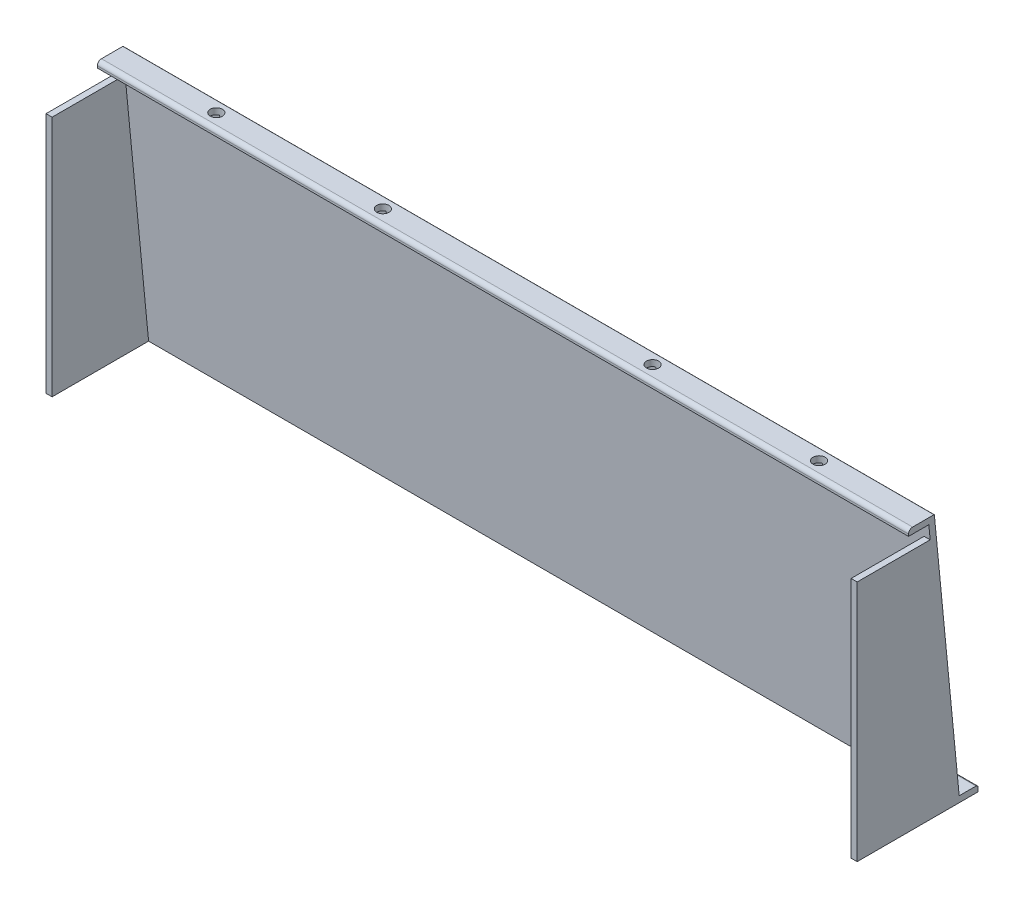
ISO-10303-21;
HEADER;
FILE_DESCRIPTION(('STEP AP214'),'2;1');
FILE_NAME('part.step','',(''),(''),'','','');
FILE_SCHEMA(('AUTOMOTIVE_DESIGN { 1 0 10303 214 1 1 1 1 }'));
ENDSEC;
DATA;
#1=APPLICATION_CONTEXT('core data for automotive mechanical design processes');
#2=APPLICATION_PROTOCOL_DEFINITION('international standard','automotive_design',2000,#1);
#3=PRODUCT_CONTEXT('',#1,'mechanical');
#4=PRODUCT('Part','Part','',(#3));
#5=PRODUCT_RELATED_PRODUCT_CATEGORY('part','',(#4));
#6=PRODUCT_DEFINITION_FORMATION('','',#4);
#7=PRODUCT_DEFINITION_CONTEXT('part definition',#1,'design');
#8=PRODUCT_DEFINITION('design','',#6,#7);
#9=PRODUCT_DEFINITION_SHAPE('','',#8);
#10=(LENGTH_UNIT() NAMED_UNIT(*) SI_UNIT(.MILLI.,.METRE.));
#11=(NAMED_UNIT(*) PLANE_ANGLE_UNIT() SI_UNIT($,.RADIAN.));
#12=(NAMED_UNIT(*) SI_UNIT($,.STERADIAN.) SOLID_ANGLE_UNIT());
#13=UNCERTAINTY_MEASURE_WITH_UNIT(LENGTH_MEASURE(1.E-05),#10,'distance_accuracy_value','');
#14=(GEOMETRIC_REPRESENTATION_CONTEXT(3) GLOBAL_UNCERTAINTY_ASSIGNED_CONTEXT((#13)) GLOBAL_UNIT_ASSIGNED_CONTEXT((#10,
#11,#12)) REPRESENTATION_CONTEXT('',''));
#15=CARTESIAN_POINT('',(0.,0.,0.));
#16=DIRECTION('',(0.,0.,1.));
#17=DIRECTION('',(1.,0.,0.));
#18=AXIS2_PLACEMENT_3D('',#15,#16,#17);
#19=CARTESIAN_POINT('',(165.,-54.139738820251,-5.69));
#20=DIRECTION('',(0.,0.0965954629432991,-0.995323724493077));
#21=DIRECTION('',(0.,0.995323724493077,0.0965954629432991));
#22=AXIS2_PLACEMENT_3D('',#19,#20,#21);
#23=PLANE('',#22);
#24=DIRECTION('',(-1.,0.,0.));
#25=VECTOR('',#24,1.);
#26=CARTESIAN_POINT('',(-16.,1.09388318904339,-0.329616079943947));
#27=LINE('',#26,#25);
#28=CARTESIAN_POINT('',(-16.,1.09388318904339,-0.329616079943947));
#29=VERTEX_POINT('',#28);
#30=CARTESIAN_POINT('',(-17.5,1.09388318904339,-0.329616079943947));
#31=VERTEX_POINT('',#30);
#32=EDGE_CURVE('E53',#29,#31,#27,.T.);
#33=ORIENTED_EDGE('',*,*,#32,.F.);
#34=DIRECTION('',(0.,0.995323724493077,0.096595462943299));
#35=VECTOR('',#34,1.);
#36=CARTESIAN_POINT('',(-16.,-58.6297388202511,-6.12575132184889));
#37=LINE('',#36,#35);
#38=CARTESIAN_POINT('',(-16.,-58.6297388202511,-6.12575132184889));
#39=VERTEX_POINT('',#38);
#40=EDGE_CURVE('E185',#39,#29,#37,.T.);
#41=ORIENTED_EDGE('',*,*,#40,.F.);
#42=DIRECTION('',(-1.,0.,0.));
#43=VECTOR('',#42,1.);
#44=CARTESIAN_POINT('',(165.,-58.6297388202511,-6.12575132184889));
#45=LINE('',#44,#43);
#46=CARTESIAN_POINT('',(181.,-58.6297388202511,-6.12575132184889));
#47=VERTEX_POINT('',#46);
#48=EDGE_CURVE('E193',#47,#39,#45,.T.);
#49=ORIENTED_EDGE('',*,*,#48,.F.);
#50=DIRECTION('',(0.,0.995323724493077,0.096595462943299));
#51=VECTOR('',#50,1.);
#52=CARTESIAN_POINT('',(181.,-58.6297388202511,-6.12575132184889));
#53=LINE('',#52,#51);
#54=CARTESIAN_POINT('',(181.,1.0938831890434,-0.329616079943946));
#55=VERTEX_POINT('',#54);
#56=EDGE_CURVE('E61',#47,#55,#53,.T.);
#57=ORIENTED_EDGE('',*,*,#56,.T.);
#58=DIRECTION('',(1.,0.,0.));
#59=VECTOR('',#58,1.);
#60=CARTESIAN_POINT('',(181.,1.09388318904339,-0.329616079943947));
#61=LINE('',#60,#59);
#62=CARTESIAN_POINT('',(182.5,1.09388318904339,-0.329616079943947));
#63=VERTEX_POINT('',#62);
#64=EDGE_CURVE('E461',#55,#63,#61,.T.);
#65=ORIENTED_EDGE('',*,*,#64,.T.);
#66=DIRECTION('',(0.,0.995323724493077,0.0965954629432991));
#67=VECTOR('',#66,1.);
#68=CARTESIAN_POINT('',(182.5,0.0418972057264861,-0.431710574998923));
#69=LINE('',#68,#67);
#70=CARTESIAN_POINT('',(182.5,4.49026117974896,0.));
#71=VERTEX_POINT('',#70);
#72=EDGE_CURVE('E440',#63,#71,#69,.T.);
#73=ORIENTED_EDGE('',*,*,#72,.T.);
#74=DIRECTION('',(-1.,0.,0.));
#75=VECTOR('',#74,1.);
#76=CARTESIAN_POINT('',(165.,4.49026117974896,0.));
#77=LINE('',#76,#75);
#78=CARTESIAN_POINT('',(157.430674827087,4.49026117974896,0.));
#79=VERTEX_POINT('',#78);
#80=EDGE_CURVE('E208',#71,#79,#77,.T.);
#81=ORIENTED_EDGE('',*,*,#80,.T.);
#82=CARTESIAN_POINT('',(156.807985478473,18.5516283667744,1.36464573246079));
#83=DIRECTION('',(0.,0.0965954629432991,-0.995323724493077));
#84=DIRECTION('',(0.,0.995323724493077,0.0965954629432991));
#85=AXIS2_PLACEMENT_3D('',#82,#83,#84);
#86=ELLIPSE('',#85,15.5286796532099,1.5);
#87=CARTESIAN_POINT('',(156.18529612986,4.49026117974896,0.));
#88=VERTEX_POINT('',#87);
#89=EDGE_CURVE('E11',#79,#88,#86,.T.);
#90=ORIENTED_EDGE('',*,*,#89,.T.);
#91=CARTESIAN_POINT('',(116.372664199688,4.49026117974896,0.));
#92=VERTEX_POINT('',#91);
#93=EDGE_CURVE('E215',#88,#92,#77,.T.);
#94=ORIENTED_EDGE('',*,*,#93,.T.);
#95=CARTESIAN_POINT('',(115.749974851074,18.5516283667743,1.36464573246079));
#96=DIRECTION('',(0.,0.0965954629432991,-0.995323724493077));
#97=DIRECTION('',(0.,0.995323724493077,0.0965954629432991));
#98=AXIS2_PLACEMENT_3D('',#95,#96,#97);
#99=ELLIPSE('',#98,15.5286796532099,1.5);
#100=CARTESIAN_POINT('',(115.127285502461,4.49026117974896,0.));
#101=VERTEX_POINT('',#100);
#102=EDGE_CURVE('E46',#92,#101,#99,.T.);
#103=ORIENTED_EDGE('',*,*,#102,.T.);
#104=CARTESIAN_POINT('',(49.8727144975393,4.49026117974896,0.));
#105=VERTEX_POINT('',#104);
#106=EDGE_CURVE('E207',#101,#105,#77,.T.);
#107=ORIENTED_EDGE('',*,*,#106,.T.);
#108=CARTESIAN_POINT('',(49.2500251489258,18.5516283667744,1.36464573246079));
#109=DIRECTION('',(0.,0.0965954629432991,-0.995323724493077));
#110=DIRECTION('',(0.,0.995323724493077,0.0965954629432991));
#111=AXIS2_PLACEMENT_3D('',#108,#109,#110);
#112=ELLIPSE('',#111,15.5286796532099,1.5);
#113=CARTESIAN_POINT('',(48.6273358003125,4.49026117974896,0.));
#114=VERTEX_POINT('',#113);
#115=EDGE_CURVE('E223',#105,#114,#112,.T.);
#116=ORIENTED_EDGE('',*,*,#115,.T.);
#117=CARTESIAN_POINT('',(8.81470387013994,4.49026117974896,0.));
#118=VERTEX_POINT('',#117);
#119=EDGE_CURVE('E205',#114,#118,#77,.T.);
#120=ORIENTED_EDGE('',*,*,#119,.T.);
#121=CARTESIAN_POINT('',(8.19201452152654,18.5516283667746,1.36464573246081));
#122=DIRECTION('',(0.,0.0965954629432991,-0.995323724493077));
#123=DIRECTION('',(0.,0.995323724493077,0.0965954629432991));
#124=AXIS2_PLACEMENT_3D('',#121,#122,#123);
#125=ELLIPSE('',#124,15.5286796532099,1.5);
#126=CARTESIAN_POINT('',(7.5693251729132,4.49026117974896,0.));
#127=VERTEX_POINT('',#126);
#128=EDGE_CURVE('E226',#118,#127,#125,.T.);
#129=ORIENTED_EDGE('',*,*,#128,.T.);
#130=CARTESIAN_POINT('',(-17.5,4.49026117974896,0.));
#131=VERTEX_POINT('',#130);
#132=EDGE_CURVE('E201',#127,#131,#77,.T.);
#133=ORIENTED_EDGE('',*,*,#132,.T.);
#134=DIRECTION('',(0.,0.995323724493077,0.0965954629432991));
#135=VECTOR('',#134,1.);
#136=CARTESIAN_POINT('',(-17.5,0.0418972057264861,-0.431710574998923));
#137=LINE('',#136,#135);
#138=EDGE_CURVE('E308',#31,#131,#137,.T.);
#139=ORIENTED_EDGE('',*,*,#138,.F.);
#140=EDGE_LOOP('',(#33,#41,#49,#57,#65,#73,#81,#90,#94,#103,#107,#116,#120,#129,#133,#139));
#141=FACE_BOUND('',#140,.T.);
#142=ADVANCED_FACE('F38',(#141),#23,.F.);
#143=CARTESIAN_POINT('',(165.,5.89026117974896,-1.27070853507839));
#144=DIRECTION('',(-1.,0.,0.));
#145=DIRECTION('',(0.,0.,1.));
#146=AXIS2_PLACEMENT_3D('',#143,#144,#145);
#147=CYLINDRICAL_SURFACE('',#146,0.099999999999998);
#148=DIRECTION('',(-1.,0.,0.));
#149=VECTOR('',#148,1.);
#150=CARTESIAN_POINT('',(165.,5.89992072604329,-1.3702409075277));
#151=LINE('',#150,#149);
#152=CARTESIAN_POINT('',(182.5,5.89992072604329,-1.3702409075277));
#153=VERTEX_POINT('',#152);
#154=CARTESIAN_POINT('',(-17.5,5.89992072604329,-1.3702409075277));
#155=VERTEX_POINT('',#154);
#156=EDGE_CURVE('E277',#153,#155,#151,.T.);
#157=ORIENTED_EDGE('',*,*,#156,.T.);
#158=CARTESIAN_POINT('',(-17.5,5.89026117974896,-1.27070853507839));
#159=DIRECTION('',(-1.,0.,0.));
#160=DIRECTION('',(0.,0.,1.));
#161=AXIS2_PLACEMENT_3D('',#158,#159,#160);
#162=CIRCLE('',#161,0.099999999999998);
#163=CARTESIAN_POINT('',(-17.5,5.99026117974896,-1.27070853507839));
#164=VERTEX_POINT('',#163);
#165=EDGE_CURVE('E396',#164,#155,#162,.T.);
#166=ORIENTED_EDGE('',*,*,#165,.F.);
#167=DIRECTION('',(-1.,0.,0.));
#168=VECTOR('',#167,1.);
#169=CARTESIAN_POINT('',(165.,5.99026117974896,-1.27070853507839));
#170=LINE('',#169,#168);
#171=CARTESIAN_POINT('',(182.5,5.99026117974896,-1.27070853507839));
#172=VERTEX_POINT('',#171);
#173=EDGE_CURVE('E221',#172,#164,#170,.T.);
#174=ORIENTED_EDGE('',*,*,#173,.F.);
#175=CARTESIAN_POINT('',(182.5,5.89026117974896,-1.27070853507839));
#176=DIRECTION('',(-1.,0.,0.));
#177=DIRECTION('',(0.,0.,1.));
#178=AXIS2_PLACEMENT_3D('',#175,#176,#177);
#179=CIRCLE('',#178,0.099999999999998);
#180=EDGE_CURVE('E401',#172,#153,#179,.T.);
#181=ORIENTED_EDGE('',*,*,#180,.T.);
#182=EDGE_LOOP('',(#157,#166,#174,#181));
#183=FACE_BOUND('',#182,.T.);
#184=ADVANCED_FACE('F40',(#183),#147,.T.);
#185=CARTESIAN_POINT('',(165.,5.99026117974896,4.00000000000003));
#186=DIRECTION('',(0.,-1.,0.));
#187=DIRECTION('',(0.,0.,-1.));
#188=AXIS2_PLACEMENT_3D('',#185,#186,#187);
#189=PLANE('',#188);
#190=CARTESIAN_POINT('',(156.807985478473,5.99026117974896,1.3646457324608));
#191=DIRECTION('',(0.,1.,0.));
#192=DIRECTION('',(0.,0.,1.));
#193=AXIS2_PLACEMENT_3D('',#190,#191,#192);
#194=CIRCLE('',#193,1.5);
#195=CARTESIAN_POINT('',(156.807985478473,5.99026117974896,2.86464573246079));
#196=VERTEX_POINT('',#195);
#197=EDGE_CURVE('E231',#196,#196,#194,.T.);
#198=ORIENTED_EDGE('',*,*,#197,.F.);
#199=EDGE_LOOP('',(#198));
#200=FACE_BOUND('',#199,.T.);
#201=CARTESIAN_POINT('',(115.749974851074,5.99026117974896,1.36464573246079));
#202=DIRECTION('',(0.,1.,0.));
#203=DIRECTION('',(0.,0.,1.));
#204=AXIS2_PLACEMENT_3D('',#201,#202,#203);
#205=CIRCLE('',#204,1.5);
#206=CARTESIAN_POINT('',(115.749974851074,5.99026117974896,2.86464573246078));
#207=VERTEX_POINT('',#206);
#208=EDGE_CURVE('E325',#207,#207,#205,.T.);
#209=ORIENTED_EDGE('',*,*,#208,.F.);
#210=EDGE_LOOP('',(#209));
#211=FACE_BOUND('',#210,.T.);
#212=CARTESIAN_POINT('',(8.19201452152654,5.99026117974896,1.36464573246081));
#213=DIRECTION('',(0.,1.,0.));
#214=DIRECTION('',(0.,0.,-1.));
#215=AXIS2_PLACEMENT_3D('',#212,#213,#214);
#216=CIRCLE('',#215,1.5);
#217=CARTESIAN_POINT('',(8.19201452152654,5.99026117974896,-0.135354267539184));
#218=VERTEX_POINT('',#217);
#219=EDGE_CURVE('E322',#218,#218,#216,.T.);
#220=ORIENTED_EDGE('',*,*,#219,.F.);
#221=EDGE_LOOP('',(#220));
#222=FACE_BOUND('',#221,.T.);
#223=CARTESIAN_POINT('',(49.2500251489258,5.99026117974896,1.3646457324608));
#224=DIRECTION('',(0.,1.,0.));
#225=DIRECTION('',(0.,0.,-1.));
#226=AXIS2_PLACEMENT_3D('',#223,#224,#225);
#227=CIRCLE('',#226,1.5);
#228=CARTESIAN_POINT('',(49.2500251489258,5.99026117974896,-0.135354267539202));
#229=VERTEX_POINT('',#228);
#230=EDGE_CURVE('E273',#229,#229,#227,.T.);
#231=ORIENTED_EDGE('',*,*,#230,.F.);
#232=EDGE_LOOP('',(#231));
#233=FACE_BOUND('',#232,.T.);
#234=ORIENTED_EDGE('',*,*,#173,.T.);
#235=DIRECTION('',(0.,0.,-1.));
#236=VECTOR('',#235,1.);
#237=CARTESIAN_POINT('',(-17.5,5.99026117974896,0.));
#238=LINE('',#237,#236);
#239=CARTESIAN_POINT('',(-17.5,5.99026117974896,4.00000000000003));
#240=VERTEX_POINT('',#239);
#241=EDGE_CURVE('E390',#240,#164,#238,.T.);
#242=ORIENTED_EDGE('',*,*,#241,.F.);
#243=DIRECTION('',(-1.,0.,0.));
#244=VECTOR('',#243,1.);
#245=CARTESIAN_POINT('',(165.,5.99026117974896,4.00000000000003));
#246=LINE('',#245,#244);
#247=CARTESIAN_POINT('',(182.5,5.99026117974896,4.00000000000003));
#248=VERTEX_POINT('',#247);
#249=EDGE_CURVE('E219',#248,#240,#246,.T.);
#250=ORIENTED_EDGE('',*,*,#249,.F.);
#251=DIRECTION('',(0.,0.,-1.));
#252=VECTOR('',#251,1.);
#253=CARTESIAN_POINT('',(182.5,5.99026117974896,0.));
#254=LINE('',#253,#252);
#255=EDGE_CURVE('E392',#248,#172,#254,.T.);
#256=ORIENTED_EDGE('',*,*,#255,.T.);
#257=EDGE_LOOP('',(#234,#242,#250,#256));
#258=FACE_BOUND('',#257,.T.);
#259=ADVANCED_FACE('F361',(#200,#211,#222,#233,#258),#189,.F.);
#260=CARTESIAN_POINT('',(165.,4.99026117974896,4.00000000000003));
#261=DIRECTION('',(-1.,0.,0.));
#262=DIRECTION('',(0.,0.,1.));
#263=AXIS2_PLACEMENT_3D('',#260,#261,#262);
#264=CYLINDRICAL_SURFACE('',#263,1.);
#265=ORIENTED_EDGE('',*,*,#249,.T.);
#266=CARTESIAN_POINT('',(-17.5,4.99026117974896,4.00000000000003));
#267=DIRECTION('',(-1.,0.,0.));
#268=DIRECTION('',(0.,0.,1.));
#269=AXIS2_PLACEMENT_3D('',#266,#267,#268);
#270=CIRCLE('',#269,1.);
#271=CARTESIAN_POINT('',(-17.5,4.99026117974896,5.00000000000003));
#272=VERTEX_POINT('',#271);
#273=EDGE_CURVE('E319',#272,#240,#270,.T.);
#274=ORIENTED_EDGE('',*,*,#273,.F.);
#275=DIRECTION('',(-1.,0.,0.));
#276=VECTOR('',#275,1.);
#277=CARTESIAN_POINT('',(165.,4.99026117974896,5.00000000000003));
#278=LINE('',#277,#276);
#279=CARTESIAN_POINT('',(182.5,4.99026117974896,5.00000000000003));
#280=VERTEX_POINT('',#279);
#281=EDGE_CURVE('E217',#280,#272,#278,.T.);
#282=ORIENTED_EDGE('',*,*,#281,.F.);
#283=CARTESIAN_POINT('',(182.5,4.99026117974896,4.00000000000003));
#284=DIRECTION('',(-1.,0.,0.));
#285=DIRECTION('',(0.,0.,1.));
#286=AXIS2_PLACEMENT_3D('',#283,#284,#285);
#287=CIRCLE('',#286,1.);
#288=EDGE_CURVE('E428',#280,#248,#287,.T.);
#289=ORIENTED_EDGE('',*,*,#288,.T.);
#290=EDGE_LOOP('',(#265,#274,#282,#289));
#291=FACE_BOUND('',#290,.T.);
#292=ADVANCED_FACE('F371',(#291),#264,.T.);
#293=CARTESIAN_POINT('',(165.,4.49026117974896,5.00000000000003));
#294=DIRECTION('',(0.,0.,-1.));
#295=DIRECTION('',(-1.,0.,0.));
#296=AXIS2_PLACEMENT_3D('',#293,#294,#295);
#297=PLANE('',#296);
#298=ORIENTED_EDGE('',*,*,#281,.T.);
#299=DIRECTION('',(0.,1.,0.));
#300=VECTOR('',#299,1.);
#301=CARTESIAN_POINT('',(-17.5,0.,5.00000000000003));
#302=LINE('',#301,#300);
#303=CARTESIAN_POINT('',(-17.5,4.49026117974896,5.00000000000003));
#304=VERTEX_POINT('',#303);
#305=EDGE_CURVE('E316',#304,#272,#302,.T.);
#306=ORIENTED_EDGE('',*,*,#305,.F.);
#307=DIRECTION('',(-1.,0.,0.));
#308=VECTOR('',#307,1.);
#309=CARTESIAN_POINT('',(165.,4.49026117974896,5.00000000000003));
#310=LINE('',#309,#308);
#311=CARTESIAN_POINT('',(182.5,4.49026117974896,5.00000000000003));
#312=VERTEX_POINT('',#311);
#313=EDGE_CURVE('E214',#312,#304,#310,.T.);
#314=ORIENTED_EDGE('',*,*,#313,.F.);
#315=DIRECTION('',(0.,1.,0.));
#316=VECTOR('',#315,1.);
#317=CARTESIAN_POINT('',(182.5,0.,5.00000000000003));
#318=LINE('',#317,#316);
#319=EDGE_CURVE('E432',#312,#280,#318,.T.);
#320=ORIENTED_EDGE('',*,*,#319,.T.);
#321=EDGE_LOOP('',(#298,#306,#314,#320));
#322=FACE_BOUND('',#321,.T.);
#323=ADVANCED_FACE('F368',(#322),#297,.F.);
#324=CARTESIAN_POINT('',(165.,4.49026117974896,0.));
#325=DIRECTION('',(0.,1.,0.));
#326=DIRECTION('',(0.,0.,1.));
#327=AXIS2_PLACEMENT_3D('',#324,#325,#326);
#328=PLANE('',#327);
#329=ORIENTED_EDGE('',*,*,#93,.F.);
#330=CARTESIAN_POINT('',(156.807985478473,4.49026117974896,1.3646457324608));
#331=DIRECTION('',(0.,1.,0.));
#332=DIRECTION('',(0.,0.,1.));
#333=AXIS2_PLACEMENT_3D('',#330,#331,#332);
#334=CIRCLE('',#333,1.5);
#335=EDGE_CURVE('E265',#88,#79,#334,.T.);
#336=ORIENTED_EDGE('',*,*,#335,.T.);
#337=ORIENTED_EDGE('',*,*,#80,.F.);
#338=DIRECTION('',(0.,0.,1.));
#339=VECTOR('',#338,1.);
#340=CARTESIAN_POINT('',(182.5,4.49026117974896,0.));
#341=LINE('',#340,#339);
#342=EDGE_CURVE('E434',#71,#312,#341,.T.);
#343=ORIENTED_EDGE('',*,*,#342,.T.);
#344=ORIENTED_EDGE('',*,*,#313,.T.);
#345=DIRECTION('',(0.,0.,1.));
#346=VECTOR('',#345,1.);
#347=CARTESIAN_POINT('',(-17.5,4.49026117974896,0.));
#348=LINE('',#347,#346);
#349=EDGE_CURVE('E313',#131,#304,#348,.T.);
#350=ORIENTED_EDGE('',*,*,#349,.F.);
#351=ORIENTED_EDGE('',*,*,#132,.F.);
#352=CARTESIAN_POINT('',(8.19201452152654,4.49026117974896,1.36464573246081));
#353=DIRECTION('',(0.,1.,0.));
#354=DIRECTION('',(0.,0.,1.));
#355=AXIS2_PLACEMENT_3D('',#352,#353,#354);
#356=CIRCLE('',#355,1.5);
#357=EDGE_CURVE('E261',#127,#118,#356,.T.);
#358=ORIENTED_EDGE('',*,*,#357,.T.);
#359=ORIENTED_EDGE('',*,*,#119,.F.);
#360=CARTESIAN_POINT('',(49.2500251489258,4.49026117974896,1.3646457324608));
#361=DIRECTION('',(0.,1.,0.));
#362=DIRECTION('',(0.,0.,1.));
#363=AXIS2_PLACEMENT_3D('',#360,#361,#362);
#364=CIRCLE('',#363,1.5);
#365=EDGE_CURVE('E257',#114,#105,#364,.T.);
#366=ORIENTED_EDGE('',*,*,#365,.T.);
#367=ORIENTED_EDGE('',*,*,#106,.F.);
#368=CARTESIAN_POINT('',(115.749974851074,4.49026117974896,1.36464573246079));
#369=DIRECTION('',(0.,1.,0.));
#370=DIRECTION('',(0.,0.,1.));
#371=AXIS2_PLACEMENT_3D('',#368,#369,#370);
#372=CIRCLE('',#371,1.5);
#373=EDGE_CURVE('E255',#101,#92,#372,.T.);
#374=ORIENTED_EDGE('',*,*,#373,.T.);
#375=EDGE_LOOP('',(#329,#336,#337,#343,#344,#350,#351,#358,#359,#366,#367,#374));
#376=FACE_BOUND('',#375,.T.);
#377=ADVANCED_FACE('F254',(#376),#328,.F.);
#378=CARTESIAN_POINT('',(165.,-58.6297388202511,-6.12575132184889));
#379=DIRECTION('',(0.,1.,0.));
#380=DIRECTION('',(0.,0.,1.));
#381=AXIS2_PLACEMENT_3D('',#378,#379,#380);
#382=PLANE('',#381);
#383=CARTESIAN_POINT('',(8.19201452152654,-58.6297388202511,-9.01169634695409));
#384=DIRECTION('',(0.,1.,0.));
#385=DIRECTION('',(0.,0.,1.));
#386=AXIS2_PLACEMENT_3D('',#383,#384,#385);
#387=CIRCLE('',#386,1.5);
#388=CARTESIAN_POINT('',(8.19201452152654,-58.6297388202511,-7.51169634695409));
#389=VERTEX_POINT('',#388);
#390=EDGE_CURVE('E243',#389,#389,#387,.T.);
#391=ORIENTED_EDGE('',*,*,#390,.T.);
#392=EDGE_LOOP('',(#391));
#393=FACE_BOUND('',#392,.T.);
#394=CARTESIAN_POINT('',(115.749974851074,-58.6297388202511,-9.01169634695409));
#395=DIRECTION('',(0.,1.,0.));
#396=DIRECTION('',(0.,0.,1.));
#397=AXIS2_PLACEMENT_3D('',#394,#395,#396);
#398=CIRCLE('',#397,1.5);
#399=CARTESIAN_POINT('',(115.749974851074,-58.6297388202511,-7.51169634695409));
#400=VERTEX_POINT('',#399);
#401=EDGE_CURVE('E239',#400,#400,#398,.T.);
#402=ORIENTED_EDGE('',*,*,#401,.T.);
#403=EDGE_LOOP('',(#402));
#404=FACE_BOUND('',#403,.T.);
#405=CARTESIAN_POINT('',(156.807985478473,-58.6297388202511,-9.01169634695409));
#406=DIRECTION('',(0.,1.,0.));
#407=DIRECTION('',(0.,0.,1.));
#408=AXIS2_PLACEMENT_3D('',#405,#406,#407);
#409=CIRCLE('',#408,1.5);
#410=CARTESIAN_POINT('',(156.807985478473,-58.6297388202511,-7.51169634695409));
#411=VERTEX_POINT('',#410);
#412=EDGE_CURVE('E235',#411,#411,#409,.T.);
#413=ORIENTED_EDGE('',*,*,#412,.T.);
#414=EDGE_LOOP('',(#413));
#415=FACE_BOUND('',#414,.T.);
#416=CARTESIAN_POINT('',(49.2500251489258,-58.6297388202511,-9.01169634695409));
#417=DIRECTION('',(0.,1.,0.));
#418=DIRECTION('',(0.,0.,1.));
#419=AXIS2_PLACEMENT_3D('',#416,#417,#418);
#420=CIRCLE('',#419,1.5);
#421=CARTESIAN_POINT('',(49.2500251489258,-58.6297388202511,-7.51169634695409));
#422=VERTEX_POINT('',#421);
#423=EDGE_CURVE('E230',#422,#422,#420,.T.);
#424=ORIENTED_EDGE('',*,*,#423,.T.);
#425=EDGE_LOOP('',(#424));
#426=FACE_BOUND('',#425,.T.);
#427=DIRECTION('',(0.,0.,-1.));
#428=VECTOR('',#427,1.);
#429=CARTESIAN_POINT('',(181.,-58.6297388202511,17.6703839200561));
#430=LINE('',#429,#428);
#431=CARTESIAN_POINT('',(181.,-58.6297388202511,17.6703839200561));
#432=VERTEX_POINT('',#431);
#433=EDGE_CURVE('E200',#432,#47,#430,.T.);
#434=ORIENTED_EDGE('',*,*,#433,.T.);
#435=ORIENTED_EDGE('',*,*,#48,.T.);
#436=DIRECTION('',(0.,0.,-1.));
#437=VECTOR('',#436,1.);
#438=CARTESIAN_POINT('',(-16.,-58.6297388202511,17.6703839200561));
#439=LINE('',#438,#437);
#440=CARTESIAN_POINT('',(-16.,-58.6297388202511,17.6703839200561));
#441=VERTEX_POINT('',#440);
#442=EDGE_CURVE('E182',#441,#39,#439,.T.);
#443=ORIENTED_EDGE('',*,*,#442,.F.);
#444=DIRECTION('',(-1.,0.,0.));
#445=VECTOR('',#444,1.);
#446=CARTESIAN_POINT('',(-16.,-58.6297388202511,17.6703839200561));
#447=LINE('',#446,#445);
#448=CARTESIAN_POINT('',(-17.5,-58.6297388202511,17.6703839200561));
#449=VERTEX_POINT('',#448);
#450=EDGE_CURVE('E466',#441,#449,#447,.T.);
#451=ORIENTED_EDGE('',*,*,#450,.T.);
#452=DIRECTION('',(0.,0.,1.));
#453=VECTOR('',#452,1.);
#454=CARTESIAN_POINT('',(-17.5,-58.6297388202511,0.));
#455=LINE('',#454,#453);
#456=CARTESIAN_POINT('',(-17.5,-58.6297388202511,-12.1257513218489));
#457=VERTEX_POINT('',#456);
#458=EDGE_CURVE('E306',#457,#449,#455,.T.);
#459=ORIENTED_EDGE('',*,*,#458,.F.);
#460=DIRECTION('',(-1.,0.,0.));
#461=VECTOR('',#460,1.);
#462=CARTESIAN_POINT('',(165.,-58.6297388202511,-12.1257513218489));
#463=LINE('',#462,#461);
#464=CARTESIAN_POINT('',(182.5,-58.6297388202511,-12.1257513218489));
#465=VERTEX_POINT('',#464);
#466=EDGE_CURVE('E202',#465,#457,#463,.T.);
#467=ORIENTED_EDGE('',*,*,#466,.F.);
#468=DIRECTION('',(0.,0.,1.));
#469=VECTOR('',#468,1.);
#470=CARTESIAN_POINT('',(182.5,-58.6297388202511,0.));
#471=LINE('',#470,#469);
#472=CARTESIAN_POINT('',(182.5,-58.6297388202511,17.6703839200561));
#473=VERTEX_POINT('',#472);
#474=EDGE_CURVE('E421',#465,#473,#471,.T.);
#475=ORIENTED_EDGE('',*,*,#474,.T.);
#476=DIRECTION('',(1.,0.,0.));
#477=VECTOR('',#476,1.);
#478=CARTESIAN_POINT('',(181.,-58.6297388202511,17.6703839200561));
#479=LINE('',#478,#477);
#480=EDGE_CURVE('E430',#432,#473,#479,.T.);
#481=ORIENTED_EDGE('',*,*,#480,.F.);
#482=EDGE_LOOP('',(#434,#435,#443,#451,#459,#467,#475,#481));
#483=FACE_BOUND('',#482,.T.);
#484=ADVANCED_FACE('F198',(#393,#404,#415,#426,#483),#382,.F.);
#485=CARTESIAN_POINT('',(165.,-58.6297388202511,-12.1257513218489));
#486=DIRECTION('',(0.,0.,1.));
#487=DIRECTION('',(1.,0.,0.));
#488=AXIS2_PLACEMENT_3D('',#485,#486,#487);
#489=PLANE('',#488);
#490=ORIENTED_EDGE('',*,*,#466,.T.);
#491=DIRECTION('',(0.,-1.,0.));
#492=VECTOR('',#491,1.);
#493=CARTESIAN_POINT('',(-17.5,0.,-12.1257513218489));
#494=LINE('',#493,#492);
#495=CARTESIAN_POINT('',(-17.5,-57.6297388202511,-12.1257513218489));
#496=VERTEX_POINT('',#495);
#497=EDGE_CURVE('E299',#496,#457,#494,.T.);
#498=ORIENTED_EDGE('',*,*,#497,.F.);
#499=DIRECTION('',(-1.,0.,0.));
#500=VECTOR('',#499,1.);
#501=CARTESIAN_POINT('',(165.,-57.6297388202511,-12.1257513218489));
#502=LINE('',#501,#500);
#503=CARTESIAN_POINT('',(182.5,-57.6297388202511,-12.1257513218489));
#504=VERTEX_POINT('',#503);
#505=EDGE_CURVE('E209',#504,#496,#502,.T.);
#506=ORIENTED_EDGE('',*,*,#505,.F.);
#507=DIRECTION('',(0.,-1.,0.));
#508=VECTOR('',#507,1.);
#509=CARTESIAN_POINT('',(182.5,0.,-12.1257513218489));
#510=LINE('',#509,#508);
#511=EDGE_CURVE('E418',#504,#465,#510,.T.);
#512=ORIENTED_EDGE('',*,*,#511,.T.);
#513=EDGE_LOOP('',(#490,#498,#506,#512));
#514=FACE_BOUND('',#513,.T.);
#515=ADVANCED_FACE('F305',(#514),#489,.F.);
#516=CARTESIAN_POINT('',(165.,-57.6297388202511,-11.6257513218489));
#517=DIRECTION('',(-1.,0.,0.));
#518=DIRECTION('',(0.,0.,1.));
#519=AXIS2_PLACEMENT_3D('',#516,#517,#518);
#520=CYLINDRICAL_SURFACE('',#519,0.5);
#521=ORIENTED_EDGE('',*,*,#505,.T.);
#522=CARTESIAN_POINT('',(-17.5,-57.6297388202511,-11.6257513218489));
#523=DIRECTION('',(-1.,0.,0.));
#524=DIRECTION('',(0.,0.,1.));
#525=AXIS2_PLACEMENT_3D('',#522,#523,#524);
#526=CIRCLE('',#525,0.5);
#527=CARTESIAN_POINT('',(-17.5,-57.1297388202511,-11.6257513218489));
#528=VERTEX_POINT('',#527);
#529=EDGE_CURVE('E287',#528,#496,#526,.T.);
#530=ORIENTED_EDGE('',*,*,#529,.F.);
#531=DIRECTION('',(-1.,0.,0.));
#532=VECTOR('',#531,1.);
#533=CARTESIAN_POINT('',(165.,-57.1297388202511,-11.6257513218489));
#534=LINE('',#533,#532);
#535=CARTESIAN_POINT('',(182.5,-57.1297388202511,-11.6257513218489));
#536=VERTEX_POINT('',#535);
#537=EDGE_CURVE('E281',#536,#528,#534,.T.);
#538=ORIENTED_EDGE('',*,*,#537,.F.);
#539=CARTESIAN_POINT('',(182.5,-57.6297388202511,-11.6257513218489));
#540=DIRECTION('',(-1.,0.,0.));
#541=DIRECTION('',(0.,0.,1.));
#542=AXIS2_PLACEMENT_3D('',#539,#540,#541);
#543=CIRCLE('',#542,0.5);
#544=EDGE_CURVE('E289',#536,#504,#543,.T.);
#545=ORIENTED_EDGE('',*,*,#544,.T.);
#546=EDGE_LOOP('',(#521,#530,#538,#545));
#547=FACE_BOUND('',#546,.T.);
#548=ADVANCED_FACE('F286',(#547),#520,.T.);
#549=CARTESIAN_POINT('',(165.,-57.1297388202511,-11.6257513218489));
#550=DIRECTION('',(0.,-1.,0.));
#551=DIRECTION('',(0.,0.,-1.));
#552=AXIS2_PLACEMENT_3D('',#549,#550,#551);
#553=PLANE('',#552);
#554=CARTESIAN_POINT('',(8.19201452152654,-57.1297388202511,-9.01169634695409));
#555=DIRECTION('',(0.,-1.,0.));
#556=DIRECTION('',(0.,0.,-1.));
#557=AXIS2_PLACEMENT_3D('',#554,#555,#556);
#558=CIRCLE('',#557,1.5);
#559=CARTESIAN_POINT('',(8.19201452152654,-57.1297388202511,-10.5116963469541));
#560=VERTEX_POINT('',#559);
#561=EDGE_CURVE('E240',#560,#560,#558,.T.);
#562=ORIENTED_EDGE('',*,*,#561,.T.);
#563=EDGE_LOOP('',(#562));
#564=FACE_BOUND('',#563,.T.);
#565=CARTESIAN_POINT('',(115.749974851074,-57.1297388202511,-9.01169634695409));
#566=DIRECTION('',(0.,-1.,0.));
#567=DIRECTION('',(0.,0.,-1.));
#568=AXIS2_PLACEMENT_3D('',#565,#566,#567);
#569=CIRCLE('',#568,1.5);
#570=CARTESIAN_POINT('',(115.749974851074,-57.1297388202511,-10.5116963469541));
#571=VERTEX_POINT('',#570);
#572=EDGE_CURVE('E236',#571,#571,#569,.T.);
#573=ORIENTED_EDGE('',*,*,#572,.T.);
#574=EDGE_LOOP('',(#573));
#575=FACE_BOUND('',#574,.T.);
#576=CARTESIAN_POINT('',(156.807985478473,-57.1297388202511,-9.01169634695409));
#577=DIRECTION('',(0.,-1.,0.));
#578=DIRECTION('',(0.,0.,-1.));
#579=AXIS2_PLACEMENT_3D('',#576,#577,#578);
#580=CIRCLE('',#579,1.5);
#581=CARTESIAN_POINT('',(156.807985478473,-57.1297388202511,-10.5116963469541));
#582=VERTEX_POINT('',#581);
#583=EDGE_CURVE('E232',#582,#582,#580,.T.);
#584=ORIENTED_EDGE('',*,*,#583,.T.);
#585=EDGE_LOOP('',(#584));
#586=FACE_BOUND('',#585,.T.);
#587=CARTESIAN_POINT('',(49.2500251489258,-57.1297388202511,-9.01169634695409));
#588=DIRECTION('',(0.,-1.,0.));
#589=DIRECTION('',(0.,0.,-1.));
#590=AXIS2_PLACEMENT_3D('',#587,#588,#589);
#591=CIRCLE('',#590,1.5);
#592=CARTESIAN_POINT('',(49.2500251489258,-57.1297388202511,-10.5116963469541));
#593=VERTEX_POINT('',#592);
#594=EDGE_CURVE('E227',#593,#593,#591,.T.);
#595=ORIENTED_EDGE('',*,*,#594,.T.);
#596=EDGE_LOOP('',(#595));
#597=FACE_BOUND('',#596,.T.);
#598=ORIENTED_EDGE('',*,*,#537,.T.);
#599=DIRECTION('',(0.,0.,-1.));
#600=VECTOR('',#599,1.);
#601=CARTESIAN_POINT('',(-17.5,-57.1297388202511,0.));
#602=LINE('',#601,#600);
#603=CARTESIAN_POINT('',(-17.5,-57.1297388202511,-7.48722475229004));
#604=VERTEX_POINT('',#603);
#605=EDGE_CURVE('E303',#604,#528,#602,.T.);
#606=ORIENTED_EDGE('',*,*,#605,.F.);
#607=DIRECTION('',(-1.,0.,0.));
#608=VECTOR('',#607,1.);
#609=CARTESIAN_POINT('',(165.,-57.1297388202511,-7.48722475229004));
#610=LINE('',#609,#608);
#611=CARTESIAN_POINT('',(182.5,-57.1297388202511,-7.48722475229004));
#612=VERTEX_POINT('',#611);
#613=EDGE_CURVE('E279',#612,#604,#610,.T.);
#614=ORIENTED_EDGE('',*,*,#613,.F.);
#615=DIRECTION('',(0.,0.,-1.));
#616=VECTOR('',#615,1.);
#617=CARTESIAN_POINT('',(182.5,-57.1297388202511,0.));
#618=LINE('',#617,#616);
#619=EDGE_CURVE('E412',#612,#536,#618,.T.);
#620=ORIENTED_EDGE('',*,*,#619,.T.);
#621=EDGE_LOOP('',(#598,#606,#614,#620));
#622=FACE_BOUND('',#621,.T.);
#623=ADVANCED_FACE('F409',(#564,#575,#586,#597,#622),#553,.F.);
#624=CARTESIAN_POINT('',(165.,5.65735876656831,-1.39378137400242));
#625=DIRECTION('',(0.,-0.0965954629432986,0.995323724493077));
#626=DIRECTION('',(0.,-0.995323724493077,-0.0965954629432986));
#627=AXIS2_PLACEMENT_3D('',#624,#625,#626);
#628=PLANE('',#627);
#629=ORIENTED_EDGE('',*,*,#613,.T.);
#630=DIRECTION('',(0.,-0.995323724493077,-0.0965954629432986));
#631=VECTOR('',#630,1.);
#632=CARTESIAN_POINT('',(-17.5,0.186790400141434,-1.92469616173854));
#633=LINE('',#632,#631);
#634=EDGE_CURVE('E398',#155,#604,#633,.T.);
#635=ORIENTED_EDGE('',*,*,#634,.F.);
#636=ORIENTED_EDGE('',*,*,#156,.F.);
#637=DIRECTION('',(0.,-0.995323724493077,-0.0965954629432986));
#638=VECTOR('',#637,1.);
#639=CARTESIAN_POINT('',(182.5,0.186790400141434,-1.92469616173854));
#640=LINE('',#639,#638);
#641=EDGE_CURVE('E403',#153,#612,#640,.T.);
#642=ORIENTED_EDGE('',*,*,#641,.T.);
#643=EDGE_LOOP('',(#629,#635,#636,#642));
#644=FACE_BOUND('',#643,.T.);
#645=ADVANCED_FACE('F424',(#644),#628,.F.);
#646=CARTESIAN_POINT('',(49.2500251489258,-60.009738820251,1.3646457324608));
#647=DIRECTION('',(0.,1.,0.));
#648=DIRECTION('',(0.,0.,1.));
#649=AXIS2_PLACEMENT_3D('',#646,#647,#648);
#650=CYLINDRICAL_SURFACE('',#649,1.5);
#651=ORIENTED_EDGE('',*,*,#230,.T.);
#652=EDGE_LOOP('',(#651));
#653=FACE_BOUND('',#652,.T.);
#654=ORIENTED_EDGE('',*,*,#115,.F.);
#655=ORIENTED_EDGE('',*,*,#365,.F.);
#656=EDGE_LOOP('',(#654,#655));
#657=FACE_BOUND('',#656,.T.);
#658=ADVANCED_FACE('F587',(#653,#657),#650,.F.);
#659=CARTESIAN_POINT('',(49.2500251489258,-60.009738820251,-9.01169634695409));
#660=DIRECTION('',(0.,1.,0.));
#661=DIRECTION('',(0.,0.,1.));
#662=AXIS2_PLACEMENT_3D('',#659,#660,#661);
#663=CYLINDRICAL_SURFACE('',#662,1.5);
#664=ORIENTED_EDGE('',*,*,#594,.F.);
#665=EDGE_LOOP('',(#664));
#666=FACE_BOUND('',#665,.T.);
#667=ORIENTED_EDGE('',*,*,#423,.F.);
#668=EDGE_LOOP('',(#667));
#669=FACE_BOUND('',#668,.T.);
#670=ADVANCED_FACE('F351',(#666,#669),#663,.F.);
#671=CARTESIAN_POINT('',(156.807985478473,-60.009738820251,-9.01169634695409));
#672=DIRECTION('',(0.,1.,0.));
#673=DIRECTION('',(0.,0.,1.));
#674=AXIS2_PLACEMENT_3D('',#671,#672,#673);
#675=CYLINDRICAL_SURFACE('',#674,1.5);
#676=ORIENTED_EDGE('',*,*,#583,.F.);
#677=EDGE_LOOP('',(#676));
#678=FACE_BOUND('',#677,.T.);
#679=ORIENTED_EDGE('',*,*,#412,.F.);
#680=EDGE_LOOP('',(#679));
#681=FACE_BOUND('',#680,.T.);
#682=ADVANCED_FACE('F341',(#678,#681),#675,.F.);
#683=CARTESIAN_POINT('',(115.749974851074,-60.009738820251,-9.01169634695409));
#684=DIRECTION('',(0.,1.,0.));
#685=DIRECTION('',(0.,0.,1.));
#686=AXIS2_PLACEMENT_3D('',#683,#684,#685);
#687=CYLINDRICAL_SURFACE('',#686,1.5);
#688=ORIENTED_EDGE('',*,*,#572,.F.);
#689=EDGE_LOOP('',(#688));
#690=FACE_BOUND('',#689,.T.);
#691=ORIENTED_EDGE('',*,*,#401,.F.);
#692=EDGE_LOOP('',(#691));
#693=FACE_BOUND('',#692,.T.);
#694=ADVANCED_FACE('F338',(#690,#693),#687,.F.);
#695=CARTESIAN_POINT('',(8.19201452152654,-60.009738820251,-9.01169634695409));
#696=DIRECTION('',(0.,1.,0.));
#697=DIRECTION('',(0.,0.,1.));
#698=AXIS2_PLACEMENT_3D('',#695,#696,#697);
#699=CYLINDRICAL_SURFACE('',#698,1.5);
#700=ORIENTED_EDGE('',*,*,#561,.F.);
#701=EDGE_LOOP('',(#700));
#702=FACE_BOUND('',#701,.T.);
#703=ORIENTED_EDGE('',*,*,#390,.F.);
#704=EDGE_LOOP('',(#703));
#705=FACE_BOUND('',#704,.T.);
#706=ADVANCED_FACE('F340',(#702,#705),#699,.F.);
#707=CARTESIAN_POINT('',(8.19201452152654,-60.009738820251,1.36464573246082));
#708=DIRECTION('',(0.,1.,0.));
#709=DIRECTION('',(0.,0.,1.));
#710=AXIS2_PLACEMENT_3D('',#707,#708,#709);
#711=CYLINDRICAL_SURFACE('',#710,1.5);
#712=ORIENTED_EDGE('',*,*,#219,.T.);
#713=EDGE_LOOP('',(#712));
#714=FACE_BOUND('',#713,.T.);
#715=ORIENTED_EDGE('',*,*,#128,.F.);
#716=ORIENTED_EDGE('',*,*,#357,.F.);
#717=EDGE_LOOP('',(#715,#716));
#718=FACE_BOUND('',#717,.T.);
#719=ADVANCED_FACE('F348',(#714,#718),#711,.F.);
#720=CARTESIAN_POINT('',(115.749974851074,-60.009738820251,1.36464573246079));
#721=DIRECTION('',(0.,1.,0.));
#722=DIRECTION('',(0.,0.,1.));
#723=AXIS2_PLACEMENT_3D('',#720,#721,#722);
#724=CYLINDRICAL_SURFACE('',#723,1.5);
#725=ORIENTED_EDGE('',*,*,#208,.T.);
#726=EDGE_LOOP('',(#725));
#727=FACE_BOUND('',#726,.T.);
#728=ORIENTED_EDGE('',*,*,#102,.F.);
#729=ORIENTED_EDGE('',*,*,#373,.F.);
#730=EDGE_LOOP('',(#728,#729));
#731=FACE_BOUND('',#730,.T.);
#732=ADVANCED_FACE('F489',(#727,#731),#724,.F.);
#733=CARTESIAN_POINT('',(156.807985478473,-60.009738820251,1.3646457324608));
#734=DIRECTION('',(0.,1.,0.));
#735=DIRECTION('',(0.,0.,1.));
#736=AXIS2_PLACEMENT_3D('',#733,#734,#735);
#737=CYLINDRICAL_SURFACE('',#736,1.5);
#738=ORIENTED_EDGE('',*,*,#197,.T.);
#739=EDGE_LOOP('',(#738));
#740=FACE_BOUND('',#739,.T.);
#741=ORIENTED_EDGE('',*,*,#89,.F.);
#742=ORIENTED_EDGE('',*,*,#335,.F.);
#743=EDGE_LOOP('',(#741,#742));
#744=FACE_BOUND('',#743,.T.);
#745=ADVANCED_FACE('F487',(#740,#744),#737,.F.);
#746=CARTESIAN_POINT('',(-17.5,0.,0.));
#747=DIRECTION('',(-1.,0.,0.));
#748=DIRECTION('',(0.,0.,1.));
#749=AXIS2_PLACEMENT_3D('',#746,#747,#748);
#750=PLANE('',#749);
#751=ORIENTED_EDGE('',*,*,#241,.T.);
#752=ORIENTED_EDGE('',*,*,#165,.T.);
#753=ORIENTED_EDGE('',*,*,#634,.T.);
#754=ORIENTED_EDGE('',*,*,#605,.T.);
#755=ORIENTED_EDGE('',*,*,#529,.T.);
#756=ORIENTED_EDGE('',*,*,#497,.T.);
#757=ORIENTED_EDGE('',*,*,#458,.T.);
#758=DIRECTION('',(0.,-1.,0.));
#759=VECTOR('',#758,1.);
#760=CARTESIAN_POINT('',(-17.5,1.09388318904339,17.6703839200561));
#761=LINE('',#760,#759);
#762=CARTESIAN_POINT('',(-17.5,1.09388318904339,17.6703839200561));
#763=VERTEX_POINT('',#762);
#764=EDGE_CURVE('E474',#763,#449,#761,.T.);
#765=ORIENTED_EDGE('',*,*,#764,.F.);
#766=DIRECTION('',(0.,0.,1.));
#767=VECTOR('',#766,1.);
#768=CARTESIAN_POINT('',(-17.5,1.09388318904339,-0.329616079943947));
#769=LINE('',#768,#767);
#770=EDGE_CURVE('E195',#31,#763,#769,.T.);
#771=ORIENTED_EDGE('',*,*,#770,.F.);
#772=ORIENTED_EDGE('',*,*,#138,.T.);
#773=ORIENTED_EDGE('',*,*,#349,.T.);
#774=ORIENTED_EDGE('',*,*,#305,.T.);
#775=ORIENTED_EDGE('',*,*,#273,.T.);
#776=EDGE_LOOP('',(#751,#752,#753,#754,#755,#756,#757,#765,#771,#772,#773,#774,#775));
#777=FACE_BOUND('',#776,.T.);
#778=ADVANCED_FACE('F298',(#777),#750,.T.);
#779=CARTESIAN_POINT('',(182.5,0.,0.));
#780=DIRECTION('',(1.,0.,0.));
#781=DIRECTION('',(0.,0.,1.));
#782=AXIS2_PLACEMENT_3D('',#779,#780,#781);
#783=PLANE('',#782);
#784=ORIENTED_EDGE('',*,*,#255,.F.);
#785=ORIENTED_EDGE('',*,*,#288,.F.);
#786=ORIENTED_EDGE('',*,*,#319,.F.);
#787=ORIENTED_EDGE('',*,*,#342,.F.);
#788=ORIENTED_EDGE('',*,*,#72,.F.);
#789=DIRECTION('',(0.,0.,1.));
#790=VECTOR('',#789,1.);
#791=CARTESIAN_POINT('',(182.5,1.09388318904339,-0.329616079943947));
#792=LINE('',#791,#790);
#793=CARTESIAN_POINT('',(182.5,1.09388318904339,17.6703839200561));
#794=VERTEX_POINT('',#793);
#795=EDGE_CURVE('E454',#63,#794,#792,.T.);
#796=ORIENTED_EDGE('',*,*,#795,.T.);
#797=DIRECTION('',(0.,-1.,0.));
#798=VECTOR('',#797,1.);
#799=CARTESIAN_POINT('',(182.5,1.09388318904339,17.6703839200561));
#800=LINE('',#799,#798);
#801=EDGE_CURVE('E447',#794,#473,#800,.T.);
#802=ORIENTED_EDGE('',*,*,#801,.T.);
#803=ORIENTED_EDGE('',*,*,#474,.F.);
#804=ORIENTED_EDGE('',*,*,#511,.F.);
#805=ORIENTED_EDGE('',*,*,#544,.F.);
#806=ORIENTED_EDGE('',*,*,#619,.F.);
#807=ORIENTED_EDGE('',*,*,#641,.F.);
#808=ORIENTED_EDGE('',*,*,#180,.F.);
#809=EDGE_LOOP('',(#784,#785,#786,#787,#788,#796,#802,#803,#804,#805,#806,#807,#808));
#810=FACE_BOUND('',#809,.T.);
#811=ADVANCED_FACE('F414',(#810),#783,.T.);
#812=CARTESIAN_POINT('',(181.,1.09388318904339,17.6703839200561));
#813=DIRECTION('',(0.,0.,1.));
#814=DIRECTION('',(1.,0.,0.));
#815=AXIS2_PLACEMENT_3D('',#812,#813,#814);
#816=PLANE('',#815);
#817=ORIENTED_EDGE('',*,*,#801,.F.);
#818=DIRECTION('',(1.,0.,0.));
#819=VECTOR('',#818,1.);
#820=CARTESIAN_POINT('',(181.,1.09388318904339,17.6703839200561));
#821=LINE('',#820,#819);
#822=CARTESIAN_POINT('',(181.,1.09388318904339,17.6703839200561));
#823=VERTEX_POINT('',#822);
#824=EDGE_CURVE('E451',#823,#794,#821,.T.);
#825=ORIENTED_EDGE('',*,*,#824,.F.);
#826=DIRECTION('',(0.,-1.,0.));
#827=VECTOR('',#826,1.);
#828=CARTESIAN_POINT('',(181.,1.09388318904339,17.6703839200561));
#829=LINE('',#828,#827);
#830=EDGE_CURVE('E450',#823,#432,#829,.T.);
#831=ORIENTED_EDGE('',*,*,#830,.T.);
#832=ORIENTED_EDGE('',*,*,#480,.T.);
#833=EDGE_LOOP('',(#817,#825,#831,#832));
#834=FACE_BOUND('',#833,.T.);
#835=ADVANCED_FACE('F446',(#834),#816,.T.);
#836=CARTESIAN_POINT('',(181.,1.09388318904339,-0.329616079943947));
#837=DIRECTION('',(0.,1.,0.));
#838=DIRECTION('',(0.,0.,1.));
#839=AXIS2_PLACEMENT_3D('',#836,#837,#838);
#840=PLANE('',#839);
#841=ORIENTED_EDGE('',*,*,#795,.F.);
#842=ORIENTED_EDGE('',*,*,#64,.F.);
#843=DIRECTION('',(0.,0.,1.));
#844=VECTOR('',#843,1.);
#845=CARTESIAN_POINT('',(181.,1.09388318904339,-0.329616079943947));
#846=LINE('',#845,#844);
#847=EDGE_CURVE('E456',#55,#823,#846,.T.);
#848=ORIENTED_EDGE('',*,*,#847,.T.);
#849=ORIENTED_EDGE('',*,*,#824,.T.);
#850=EDGE_LOOP('',(#841,#842,#848,#849));
#851=FACE_BOUND('',#850,.T.);
#852=ADVANCED_FACE('F606',(#851),#840,.T.);
#853=CARTESIAN_POINT('',(181.,0.,0.));
#854=DIRECTION('',(1.,0.,0.));
#855=DIRECTION('',(0.,0.,-1.));
#856=AXIS2_PLACEMENT_3D('',#853,#854,#855);
#857=PLANE('',#856);
#858=ORIENTED_EDGE('',*,*,#56,.F.);
#859=ORIENTED_EDGE('',*,*,#433,.F.);
#860=ORIENTED_EDGE('',*,*,#830,.F.);
#861=ORIENTED_EDGE('',*,*,#847,.F.);
#862=EDGE_LOOP('',(#858,#859,#860,#861));
#863=FACE_BOUND('',#862,.T.);
#864=ADVANCED_FACE('F615',(#863),#857,.F.);
#865=CARTESIAN_POINT('',(-16.,1.09388318904339,-0.329616079943947));
#866=DIRECTION('',(0.,-1.,0.));
#867=DIRECTION('',(0.,0.,-1.));
#868=AXIS2_PLACEMENT_3D('',#865,#866,#867);
#869=PLANE('',#868);
#870=ORIENTED_EDGE('',*,*,#770,.T.);
#871=DIRECTION('',(-1.,0.,0.));
#872=VECTOR('',#871,1.);
#873=CARTESIAN_POINT('',(-16.,1.09388318904339,17.6703839200561));
#874=LINE('',#873,#872);
#875=CARTESIAN_POINT('',(-16.,1.09388318904339,17.6703839200561));
#876=VERTEX_POINT('',#875);
#877=EDGE_CURVE('E468',#876,#763,#874,.T.);
#878=ORIENTED_EDGE('',*,*,#877,.F.);
#879=DIRECTION('',(0.,0.,1.));
#880=VECTOR('',#879,1.);
#881=CARTESIAN_POINT('',(-16.,1.09388318904339,-0.329616079943947));
#882=LINE('',#881,#880);
#883=EDGE_CURVE('E469',#29,#876,#882,.T.);
#884=ORIENTED_EDGE('',*,*,#883,.F.);
#885=ORIENTED_EDGE('',*,*,#32,.T.);
#886=EDGE_LOOP('',(#870,#878,#884,#885));
#887=FACE_BOUND('',#886,.T.);
#888=ADVANCED_FACE('F479',(#887),#869,.F.);
#889=CARTESIAN_POINT('',(-16.,1.09388318904339,17.6703839200561));
#890=DIRECTION('',(0.,0.,-1.));
#891=DIRECTION('',(-1.,0.,0.));
#892=AXIS2_PLACEMENT_3D('',#889,#890,#891);
#893=PLANE('',#892);
#894=ORIENTED_EDGE('',*,*,#764,.T.);
#895=ORIENTED_EDGE('',*,*,#450,.F.);
#896=DIRECTION('',(0.,-1.,0.));
#897=VECTOR('',#896,1.);
#898=CARTESIAN_POINT('',(-16.,1.09388318904339,17.6703839200561));
#899=LINE('',#898,#897);
#900=EDGE_CURVE('E187',#876,#441,#899,.T.);
#901=ORIENTED_EDGE('',*,*,#900,.F.);
#902=ORIENTED_EDGE('',*,*,#877,.T.);
#903=EDGE_LOOP('',(#894,#895,#901,#902));
#904=FACE_BOUND('',#903,.T.);
#905=ADVANCED_FACE('F482',(#904),#893,.F.);
#906=CARTESIAN_POINT('',(-16.,0.,0.));
#907=DIRECTION('',(-1.,0.,0.));
#908=DIRECTION('',(0.,0.,-1.));
#909=AXIS2_PLACEMENT_3D('',#906,#907,#908);
#910=PLANE('',#909);
#911=ORIENTED_EDGE('',*,*,#40,.T.);
#912=ORIENTED_EDGE('',*,*,#883,.T.);
#913=ORIENTED_EDGE('',*,*,#900,.T.);
#914=ORIENTED_EDGE('',*,*,#442,.T.);
#915=EDGE_LOOP('',(#911,#912,#913,#914));
#916=FACE_BOUND('',#915,.T.);
#917=ADVANCED_FACE('F184',(#916),#910,.F.);
#918=CLOSED_SHELL('',(#142,#184,#259,#292,#323,#377,#484,#515,#548,#623,#645,#658,#670,#682,
#694,#706,#719,#732,#745,#778,#811,#835,#852,#864,#888,#905,#917));
#919=MANIFOLD_SOLID_BREP('B2',#918);
#920=ADVANCED_BREP_SHAPE_REPRESENTATION('',(#18,#919),#14);
#921=SHAPE_DEFINITION_REPRESENTATION(#9,#920);
ENDSEC;
END-ISO-10303-21;
